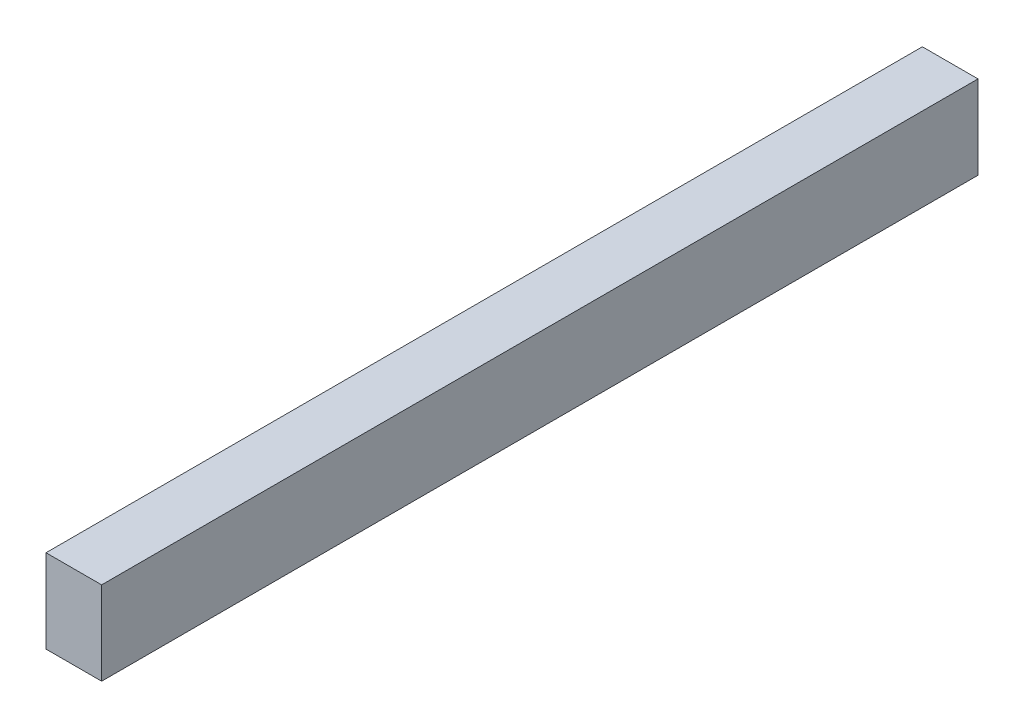
ISO-10303-21;
HEADER;
FILE_DESCRIPTION(('STEP AP214'),'2;1');
FILE_NAME('part.step','',(''),(''),'','','');
FILE_SCHEMA(('AUTOMOTIVE_DESIGN { 1 0 10303 214 1 1 1 1 }'));
ENDSEC;
DATA;
#1=APPLICATION_CONTEXT('core data for automotive mechanical design processes');
#2=APPLICATION_PROTOCOL_DEFINITION('international standard','automotive_design',2000,#1);
#3=PRODUCT_CONTEXT('',#1,'mechanical');
#4=PRODUCT('Part','Part','',(#3));
#5=PRODUCT_RELATED_PRODUCT_CATEGORY('part','',(#4));
#6=PRODUCT_DEFINITION_FORMATION('','',#4);
#7=PRODUCT_DEFINITION_CONTEXT('part definition',#1,'design');
#8=PRODUCT_DEFINITION('design','',#6,#7);
#9=PRODUCT_DEFINITION_SHAPE('','',#8);
#10=(LENGTH_UNIT() NAMED_UNIT(*) SI_UNIT(.MILLI.,.METRE.));
#11=(NAMED_UNIT(*) PLANE_ANGLE_UNIT() SI_UNIT($,.RADIAN.));
#12=(NAMED_UNIT(*) SI_UNIT($,.STERADIAN.) SOLID_ANGLE_UNIT());
#13=UNCERTAINTY_MEASURE_WITH_UNIT(LENGTH_MEASURE(1.E-05),#10,'distance_accuracy_value','');
#14=(GEOMETRIC_REPRESENTATION_CONTEXT(3) GLOBAL_UNCERTAINTY_ASSIGNED_CONTEXT((#13)) GLOBAL_UNIT_ASSIGNED_CONTEXT((#10,
#11,#12)) REPRESENTATION_CONTEXT('',''));
#15=CARTESIAN_POINT('',(0.,0.,0.));
#16=DIRECTION('',(0.,0.,1.));
#17=DIRECTION('',(1.,0.,0.));
#18=AXIS2_PLACEMENT_3D('',#15,#16,#17);
#19=CARTESIAN_POINT('',(4.,-3.,-31.5));
#20=DIRECTION('',(0.,0.,1.));
#21=DIRECTION('',(1.,0.,0.));
#22=AXIS2_PLACEMENT_3D('',#19,#20,#21);
#23=PLANE('',#22);
#24=DIRECTION('',(0.,1.,0.));
#25=VECTOR('',#24,1.);
#26=CARTESIAN_POINT('',(0.,-3.,-31.5));
#27=LINE('',#26,#25);
#28=CARTESIAN_POINT('',(0.,-3.,-31.5));
#29=VERTEX_POINT('',#28);
#30=CARTESIAN_POINT('',(0.,3.,-31.5));
#31=VERTEX_POINT('',#30);
#32=EDGE_CURVE('E97',#29,#31,#27,.T.);
#33=ORIENTED_EDGE('',*,*,#32,.T.);
#34=DIRECTION('',(-1.,0.,0.));
#35=VECTOR('',#34,1.);
#36=CARTESIAN_POINT('',(4.,3.,-31.5));
#37=LINE('',#36,#35);
#38=CARTESIAN_POINT('',(4.,3.,-31.5));
#39=VERTEX_POINT('',#38);
#40=EDGE_CURVE('E11',#39,#31,#37,.T.);
#41=ORIENTED_EDGE('',*,*,#40,.F.);
#42=DIRECTION('',(0.,1.,0.));
#43=VECTOR('',#42,1.);
#44=CARTESIAN_POINT('',(4.,-3.,-31.5));
#45=LINE('',#44,#43);
#46=CARTESIAN_POINT('',(4.,-3.,-31.5));
#47=VERTEX_POINT('',#46);
#48=EDGE_CURVE('E85',#47,#39,#45,.T.);
#49=ORIENTED_EDGE('',*,*,#48,.F.);
#50=DIRECTION('',(-1.,0.,0.));
#51=VECTOR('',#50,1.);
#52=CARTESIAN_POINT('',(4.,-3.,-31.5));
#53=LINE('',#52,#51);
#54=EDGE_CURVE('E93',#47,#29,#53,.T.);
#55=ORIENTED_EDGE('',*,*,#54,.T.);
#56=EDGE_LOOP('',(#33,#41,#49,#55));
#57=FACE_BOUND('',#56,.T.);
#58=ADVANCED_FACE('F34',(#57),#23,.F.);
#59=CARTESIAN_POINT('',(4.,3.,31.5));
#60=DIRECTION('',(0.,-1.,0.));
#61=DIRECTION('',(0.,0.,-1.));
#62=AXIS2_PLACEMENT_3D('',#59,#60,#61);
#63=PLANE('',#62);
#64=DIRECTION('',(0.,0.,1.));
#65=VECTOR('',#64,1.);
#66=CARTESIAN_POINT('',(0.,3.,31.5));
#67=LINE('',#66,#65);
#68=CARTESIAN_POINT('',(0.,3.,31.5));
#69=VERTEX_POINT('',#68);
#70=EDGE_CURVE('E89',#31,#69,#67,.T.);
#71=ORIENTED_EDGE('',*,*,#70,.T.);
#72=DIRECTION('',(-1.,0.,0.));
#73=VECTOR('',#72,1.);
#74=CARTESIAN_POINT('',(4.,3.,31.5));
#75=LINE('',#74,#73);
#76=CARTESIAN_POINT('',(4.,3.,31.5));
#77=VERTEX_POINT('',#76);
#78=EDGE_CURVE('E42',#77,#69,#75,.T.);
#79=ORIENTED_EDGE('',*,*,#78,.F.);
#80=DIRECTION('',(0.,0.,1.));
#81=VECTOR('',#80,1.);
#82=CARTESIAN_POINT('',(4.,3.,31.5));
#83=LINE('',#82,#81);
#84=EDGE_CURVE('E80',#39,#77,#83,.T.);
#85=ORIENTED_EDGE('',*,*,#84,.F.);
#86=ORIENTED_EDGE('',*,*,#40,.T.);
#87=EDGE_LOOP('',(#71,#79,#85,#86));
#88=FACE_BOUND('',#87,.T.);
#89=ADVANCED_FACE('F88',(#88),#63,.F.);
#90=CARTESIAN_POINT('',(4.,-3.,31.5));
#91=DIRECTION('',(0.,0.,-1.));
#92=DIRECTION('',(-1.,0.,0.));
#93=AXIS2_PLACEMENT_3D('',#90,#91,#92);
#94=PLANE('',#93);
#95=DIRECTION('',(0.,-1.,0.));
#96=VECTOR('',#95,1.);
#97=CARTESIAN_POINT('',(0.,-3.,31.5));
#98=LINE('',#97,#96);
#99=CARTESIAN_POINT('',(0.,-3.,31.5));
#100=VERTEX_POINT('',#99);
#101=EDGE_CURVE('E67',#69,#100,#98,.T.);
#102=ORIENTED_EDGE('',*,*,#101,.T.);
#103=DIRECTION('',(-1.,0.,0.));
#104=VECTOR('',#103,1.);
#105=CARTESIAN_POINT('',(4.,-3.,31.5));
#106=LINE('',#105,#104);
#107=CARTESIAN_POINT('',(4.,-3.,31.5));
#108=VERTEX_POINT('',#107);
#109=EDGE_CURVE('E90',#108,#100,#106,.T.);
#110=ORIENTED_EDGE('',*,*,#109,.F.);
#111=DIRECTION('',(0.,-1.,0.));
#112=VECTOR('',#111,1.);
#113=CARTESIAN_POINT('',(4.,-3.,31.5));
#114=LINE('',#113,#112);
#115=EDGE_CURVE('E83',#77,#108,#114,.T.);
#116=ORIENTED_EDGE('',*,*,#115,.F.);
#117=ORIENTED_EDGE('',*,*,#78,.T.);
#118=EDGE_LOOP('',(#102,#110,#116,#117));
#119=FACE_BOUND('',#118,.T.);
#120=ADVANCED_FACE('F91',(#119),#94,.F.);
#121=CARTESIAN_POINT('',(4.,-3.,31.5));
#122=DIRECTION('',(0.,1.,0.));
#123=DIRECTION('',(0.,0.,1.));
#124=AXIS2_PLACEMENT_3D('',#121,#122,#123);
#125=PLANE('',#124);
#126=DIRECTION('',(0.,0.,-1.));
#127=VECTOR('',#126,1.);
#128=CARTESIAN_POINT('',(0.,-3.,31.5));
#129=LINE('',#128,#127);
#130=EDGE_CURVE('E73',#100,#29,#129,.T.);
#131=ORIENTED_EDGE('',*,*,#130,.T.);
#132=ORIENTED_EDGE('',*,*,#54,.F.);
#133=DIRECTION('',(0.,0.,-1.));
#134=VECTOR('',#133,1.);
#135=CARTESIAN_POINT('',(4.,-3.,31.5));
#136=LINE('',#135,#134);
#137=EDGE_CURVE('E50',#108,#47,#136,.T.);
#138=ORIENTED_EDGE('',*,*,#137,.F.);
#139=ORIENTED_EDGE('',*,*,#109,.T.);
#140=EDGE_LOOP('',(#131,#132,#138,#139));
#141=FACE_BOUND('',#140,.T.);
#142=ADVANCED_FACE('F104',(#141),#125,.F.);
#143=CARTESIAN_POINT('',(4.,0.,0.));
#144=DIRECTION('',(-1.,0.,0.));
#145=DIRECTION('',(0.,0.,1.));
#146=AXIS2_PLACEMENT_3D('',#143,#144,#145);
#147=PLANE('',#146);
#148=ORIENTED_EDGE('',*,*,#48,.T.);
#149=ORIENTED_EDGE('',*,*,#84,.T.);
#150=ORIENTED_EDGE('',*,*,#115,.T.);
#151=ORIENTED_EDGE('',*,*,#137,.T.);
#152=EDGE_LOOP('',(#148,#149,#150,#151));
#153=FACE_BOUND('',#152,.T.);
#154=ADVANCED_FACE('F81',(#153),#147,.F.);
#155=CARTESIAN_POINT('',(0.,0.,0.));
#156=DIRECTION('',(-1.,0.,0.));
#157=DIRECTION('',(0.,0.,1.));
#158=AXIS2_PLACEMENT_3D('',#155,#156,#157);
#159=PLANE('',#158);
#160=ORIENTED_EDGE('',*,*,#32,.F.);
#161=ORIENTED_EDGE('',*,*,#130,.F.);
#162=ORIENTED_EDGE('',*,*,#101,.F.);
#163=ORIENTED_EDGE('',*,*,#70,.F.);
#164=EDGE_LOOP('',(#160,#161,#162,#163));
#165=FACE_BOUND('',#164,.T.);
#166=ADVANCED_FACE('F107',(#165),#159,.T.);
#167=CLOSED_SHELL('',(#58,#89,#120,#142,#154,#166));
#168=MANIFOLD_SOLID_BREP('B2',#167);
#169=ADVANCED_BREP_SHAPE_REPRESENTATION('',(#18,#168),#14);
#170=SHAPE_DEFINITION_REPRESENTATION(#9,#169);
ENDSEC;
END-ISO-10303-21;
